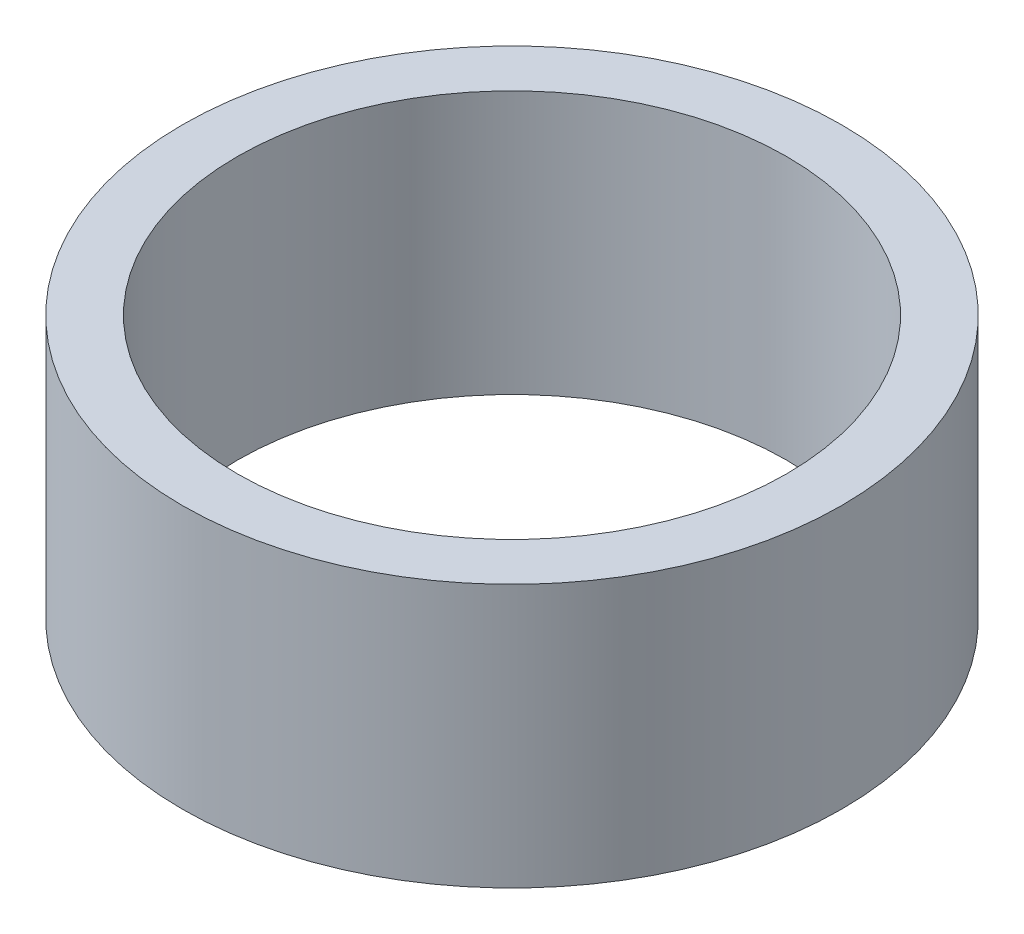
ISO-10303-21;
HEADER;
FILE_DESCRIPTION(('STEP AP214'),'2;1');
FILE_NAME('part.step','',(''),(''),'','','');
FILE_SCHEMA(('AUTOMOTIVE_DESIGN { 1 0 10303 214 1 1 1 1 }'));
ENDSEC;
DATA;
#1=APPLICATION_CONTEXT('core data for automotive mechanical design processes');
#2=APPLICATION_PROTOCOL_DEFINITION('international standard','automotive_design',2000,#1);
#3=PRODUCT_CONTEXT('',#1,'mechanical');
#4=PRODUCT('Part','Part','',(#3));
#5=PRODUCT_RELATED_PRODUCT_CATEGORY('part','',(#4));
#6=PRODUCT_DEFINITION_FORMATION('','',#4);
#7=PRODUCT_DEFINITION_CONTEXT('part definition',#1,'design');
#8=PRODUCT_DEFINITION('design','',#6,#7);
#9=PRODUCT_DEFINITION_SHAPE('','',#8);
#10=(LENGTH_UNIT() NAMED_UNIT(*) SI_UNIT(.MILLI.,.METRE.));
#11=(NAMED_UNIT(*) PLANE_ANGLE_UNIT() SI_UNIT($,.RADIAN.));
#12=(NAMED_UNIT(*) SI_UNIT($,.STERADIAN.) SOLID_ANGLE_UNIT());
#13=UNCERTAINTY_MEASURE_WITH_UNIT(LENGTH_MEASURE(1.E-05),#10,'distance_accuracy_value','');
#14=(GEOMETRIC_REPRESENTATION_CONTEXT(3) GLOBAL_UNCERTAINTY_ASSIGNED_CONTEXT((#13)) GLOBAL_UNIT_ASSIGNED_CONTEXT((#10,
#11,#12)) REPRESENTATION_CONTEXT('',''));
#15=CARTESIAN_POINT('',(0.,0.,0.));
#16=DIRECTION('',(0.,0.,1.));
#17=DIRECTION('',(1.,0.,0.));
#18=AXIS2_PLACEMENT_3D('',#15,#16,#17);
#19=CARTESIAN_POINT('',(0.,47.86,0.));
#20=DIRECTION('',(0.,1.,0.));
#21=DIRECTION('',(0.,0.,1.));
#22=AXIS2_PLACEMENT_3D('',#19,#20,#21);
#23=PLANE('',#22);
#24=CARTESIAN_POINT('',(0.,47.86,0.));
#25=DIRECTION('',(0.,1.,0.));
#26=DIRECTION('',(0.,0.,1.));
#27=AXIS2_PLACEMENT_3D('',#24,#25,#26);
#28=CIRCLE('',#27,60.);
#29=CARTESIAN_POINT('',(0.,47.86,60.));
#30=VERTEX_POINT('',#29);
#31=EDGE_CURVE('E10',#30,#30,#28,.T.);
#32=ORIENTED_EDGE('',*,*,#31,.T.);
#33=EDGE_LOOP('',(#32));
#34=FACE_BOUND('',#33,.T.);
#35=CARTESIAN_POINT('',(0.,47.86,0.));
#36=DIRECTION('',(0.,1.,0.));
#37=DIRECTION('',(0.,0.,1.));
#38=AXIS2_PLACEMENT_3D('',#35,#36,#37);
#39=CIRCLE('',#38,50.);
#40=CARTESIAN_POINT('',(0.,47.86,50.));
#41=VERTEX_POINT('',#40);
#42=EDGE_CURVE('E55',#41,#41,#39,.T.);
#43=ORIENTED_EDGE('',*,*,#42,.F.);
#44=EDGE_LOOP('',(#43));
#45=FACE_BOUND('',#44,.T.);
#46=ADVANCED_FACE('F41',(#34,#45),#23,.T.);
#47=CARTESIAN_POINT('',(0.,0.,0.));
#48=DIRECTION('',(0.,1.,0.));
#49=DIRECTION('',(0.,0.,1.));
#50=AXIS2_PLACEMENT_3D('',#47,#48,#49);
#51=PLANE('',#50);
#52=CARTESIAN_POINT('',(0.,0.,0.));
#53=DIRECTION('',(0.,1.,0.));
#54=DIRECTION('',(0.,0.,1.));
#55=AXIS2_PLACEMENT_3D('',#52,#53,#54);
#56=CIRCLE('',#55,60.);
#57=CARTESIAN_POINT('',(0.,0.,60.));
#58=VERTEX_POINT('',#57);
#59=EDGE_CURVE('E45',#58,#58,#56,.T.);
#60=ORIENTED_EDGE('',*,*,#59,.F.);
#61=EDGE_LOOP('',(#60));
#62=FACE_BOUND('',#61,.T.);
#63=CARTESIAN_POINT('',(0.,0.,0.));
#64=DIRECTION('',(0.,1.,0.));
#65=DIRECTION('',(0.,0.,1.));
#66=AXIS2_PLACEMENT_3D('',#63,#64,#65);
#67=CIRCLE('',#66,50.);
#68=CARTESIAN_POINT('',(0.,0.,50.));
#69=VERTEX_POINT('',#68);
#70=EDGE_CURVE('E57',#69,#69,#67,.T.);
#71=ORIENTED_EDGE('',*,*,#70,.T.);
#72=EDGE_LOOP('',(#71));
#73=FACE_BOUND('',#72,.T.);
#74=ADVANCED_FACE('F68',(#62,#73),#51,.F.);
#75=CARTESIAN_POINT('',(0.,47.86,0.));
#76=DIRECTION('',(0.,-1.,0.));
#77=DIRECTION('',(0.,0.,-1.));
#78=AXIS2_PLACEMENT_3D('',#75,#76,#77);
#79=CYLINDRICAL_SURFACE('',#78,60.);
#80=ORIENTED_EDGE('',*,*,#31,.F.);
#81=EDGE_LOOP('',(#80));
#82=FACE_BOUND('',#81,.T.);
#83=ORIENTED_EDGE('',*,*,#59,.T.);
#84=EDGE_LOOP('',(#83));
#85=FACE_BOUND('',#84,.T.);
#86=ADVANCED_FACE('F43',(#82,#85),#79,.T.);
#87=CARTESIAN_POINT('',(0.,47.86,0.));
#88=DIRECTION('',(0.,-1.,0.));
#89=DIRECTION('',(0.,0.,-1.));
#90=AXIS2_PLACEMENT_3D('',#87,#88,#89);
#91=CYLINDRICAL_SURFACE('',#90,50.);
#92=ORIENTED_EDGE('',*,*,#42,.T.);
#93=EDGE_LOOP('',(#92));
#94=FACE_BOUND('',#93,.T.);
#95=ORIENTED_EDGE('',*,*,#70,.F.);
#96=EDGE_LOOP('',(#95));
#97=FACE_BOUND('',#96,.T.);
#98=ADVANCED_FACE('F64',(#94,#97),#91,.F.);
#99=CLOSED_SHELL('',(#46,#74,#86,#98));
#100=MANIFOLD_SOLID_BREP('B2',#99);
#101=ADVANCED_BREP_SHAPE_REPRESENTATION('',(#18,#100),#14);
#102=SHAPE_DEFINITION_REPRESENTATION(#9,#101);
ENDSEC;
END-ISO-10303-21;
